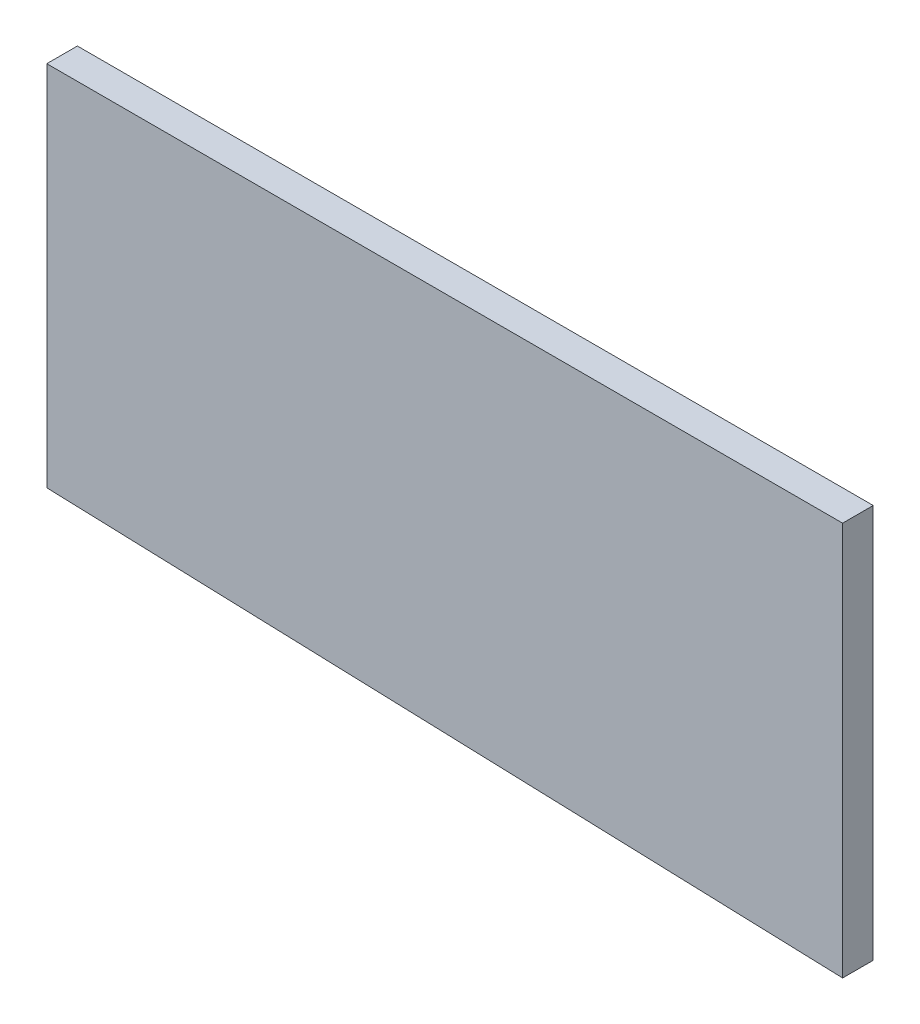
ISO-10303-21;
HEADER;
FILE_DESCRIPTION(('STEP AP214'),'2;1');
FILE_NAME('part.step','',(''),(''),'','','');
FILE_SCHEMA(('AUTOMOTIVE_DESIGN { 1 0 10303 214 1 1 1 1 }'));
ENDSEC;
DATA;
#1=APPLICATION_CONTEXT('core data for automotive mechanical design processes');
#2=APPLICATION_PROTOCOL_DEFINITION('international standard','automotive_design',2000,#1);
#3=PRODUCT_CONTEXT('',#1,'mechanical');
#4=PRODUCT('Part','Part','',(#3));
#5=PRODUCT_RELATED_PRODUCT_CATEGORY('part','',(#4));
#6=PRODUCT_DEFINITION_FORMATION('','',#4);
#7=PRODUCT_DEFINITION_CONTEXT('part definition',#1,'design');
#8=PRODUCT_DEFINITION('design','',#6,#7);
#9=PRODUCT_DEFINITION_SHAPE('','',#8);
#10=(LENGTH_UNIT() NAMED_UNIT(*) SI_UNIT(.MILLI.,.METRE.));
#11=(NAMED_UNIT(*) PLANE_ANGLE_UNIT() SI_UNIT($,.RADIAN.));
#12=(NAMED_UNIT(*) SI_UNIT($,.STERADIAN.) SOLID_ANGLE_UNIT());
#13=UNCERTAINTY_MEASURE_WITH_UNIT(LENGTH_MEASURE(1.E-05),#10,'distance_accuracy_value','');
#14=(GEOMETRIC_REPRESENTATION_CONTEXT(3) GLOBAL_UNCERTAINTY_ASSIGNED_CONTEXT((#13)) GLOBAL_UNIT_ASSIGNED_CONTEXT((#10,
#11,#12)) REPRESENTATION_CONTEXT('',''));
#15=CARTESIAN_POINT('',(0.,0.,0.));
#16=DIRECTION('',(0.,0.,1.));
#17=DIRECTION('',(1.,0.,0.));
#18=AXIS2_PLACEMENT_3D('',#15,#16,#17);
#19=CARTESIAN_POINT('',(0.,-60.,5.));
#20=DIRECTION('',(1.,0.,0.));
#21=DIRECTION('',(0.,0.,-1.));
#22=AXIS2_PLACEMENT_3D('',#19,#20,#21);
#23=PLANE('',#22);
#24=DIRECTION('',(0.,-1.,0.));
#25=VECTOR('',#24,1.);
#26=CARTESIAN_POINT('',(0.,-60.,0.));
#27=LINE('',#26,#25);
#28=CARTESIAN_POINT('',(0.,0.,0.));
#29=VERTEX_POINT('',#28);
#30=CARTESIAN_POINT('',(0.,-60.,0.));
#31=VERTEX_POINT('',#30);
#32=EDGE_CURVE('E107',#29,#31,#27,.T.);
#33=ORIENTED_EDGE('',*,*,#32,.T.);
#34=DIRECTION('',(0.,0.,-1.));
#35=VECTOR('',#34,1.);
#36=CARTESIAN_POINT('',(0.,-60.,5.));
#37=LINE('',#36,#35);
#38=CARTESIAN_POINT('',(0.,-60.,5.));
#39=VERTEX_POINT('',#38);
#40=EDGE_CURVE('E11',#39,#31,#37,.T.);
#41=ORIENTED_EDGE('',*,*,#40,.F.);
#42=DIRECTION('',(0.,-1.,0.));
#43=VECTOR('',#42,1.);
#44=CARTESIAN_POINT('',(0.,-60.,5.));
#45=LINE('',#44,#43);
#46=CARTESIAN_POINT('',(0.,0.,5.));
#47=VERTEX_POINT('',#46);
#48=EDGE_CURVE('E91',#47,#39,#45,.T.);
#49=ORIENTED_EDGE('',*,*,#48,.F.);
#50=DIRECTION('',(0.,0.,-1.));
#51=VECTOR('',#50,1.);
#52=CARTESIAN_POINT('',(0.,0.,5.));
#53=LINE('',#52,#51);
#54=EDGE_CURVE('E103',#47,#29,#53,.T.);
#55=ORIENTED_EDGE('',*,*,#54,.T.);
#56=EDGE_LOOP('',(#33,#41,#49,#55));
#57=FACE_BOUND('',#56,.T.);
#58=ADVANCED_FACE('F39',(#57),#23,.F.);
#59=CARTESIAN_POINT('',(130.,-64.3463687150838,5.));
#60=DIRECTION('',(0.0334149350096506,0.999441565134401,0.));
#61=DIRECTION('',(-0.999441565134401,0.0334149350096506,0.));
#62=AXIS2_PLACEMENT_3D('',#59,#60,#61);
#63=PLANE('',#62);
#64=DIRECTION('',(0.999441565134401,-0.0334149350096506,0.));
#65=VECTOR('',#64,1.);
#66=CARTESIAN_POINT('',(130.,-64.3463687150838,0.));
#67=LINE('',#66,#65);
#68=CARTESIAN_POINT('',(130.,-64.3463687150838,0.));
#69=VERTEX_POINT('',#68);
#70=EDGE_CURVE('E96',#31,#69,#67,.T.);
#71=ORIENTED_EDGE('',*,*,#70,.T.);
#72=DIRECTION('',(0.,0.,-1.));
#73=VECTOR('',#72,1.);
#74=CARTESIAN_POINT('',(130.,-64.3463687150838,5.));
#75=LINE('',#74,#73);
#76=CARTESIAN_POINT('',(130.,-64.3463687150838,5.));
#77=VERTEX_POINT('',#76);
#78=EDGE_CURVE('E48',#77,#69,#75,.T.);
#79=ORIENTED_EDGE('',*,*,#78,.F.);
#80=DIRECTION('',(0.999441565134401,-0.0334149350096506,0.));
#81=VECTOR('',#80,1.);
#82=CARTESIAN_POINT('',(130.,-64.3463687150838,5.));
#83=LINE('',#82,#81);
#84=EDGE_CURVE('E86',#39,#77,#83,.T.);
#85=ORIENTED_EDGE('',*,*,#84,.F.);
#86=ORIENTED_EDGE('',*,*,#40,.T.);
#87=EDGE_LOOP('',(#71,#79,#85,#86));
#88=FACE_BOUND('',#87,.T.);
#89=ADVANCED_FACE('F95',(#88),#63,.F.);
#90=CARTESIAN_POINT('',(130.,0.,5.));
#91=DIRECTION('',(-1.,0.,0.));
#92=DIRECTION('',(0.,0.,1.));
#93=AXIS2_PLACEMENT_3D('',#90,#91,#92);
#94=PLANE('',#93);
#95=DIRECTION('',(0.,1.,0.));
#96=VECTOR('',#95,1.);
#97=CARTESIAN_POINT('',(130.,0.,0.));
#98=LINE('',#97,#96);
#99=CARTESIAN_POINT('',(130.,0.,0.));
#100=VERTEX_POINT('',#99);
#101=EDGE_CURVE('E73',#69,#100,#98,.T.);
#102=ORIENTED_EDGE('',*,*,#101,.T.);
#103=DIRECTION('',(0.,0.,-1.));
#104=VECTOR('',#103,1.);
#105=CARTESIAN_POINT('',(130.,0.,5.));
#106=LINE('',#105,#104);
#107=CARTESIAN_POINT('',(130.,0.,5.));
#108=VERTEX_POINT('',#107);
#109=EDGE_CURVE('E98',#108,#100,#106,.T.);
#110=ORIENTED_EDGE('',*,*,#109,.F.);
#111=DIRECTION('',(0.,1.,0.));
#112=VECTOR('',#111,1.);
#113=CARTESIAN_POINT('',(130.,0.,5.));
#114=LINE('',#113,#112);
#115=EDGE_CURVE('E89',#77,#108,#114,.T.);
#116=ORIENTED_EDGE('',*,*,#115,.F.);
#117=ORIENTED_EDGE('',*,*,#78,.T.);
#118=EDGE_LOOP('',(#102,#110,#116,#117));
#119=FACE_BOUND('',#118,.T.);
#120=ADVANCED_FACE('F99',(#119),#94,.F.);
#121=CARTESIAN_POINT('',(0.,0.,5.));
#122=DIRECTION('',(0.,-1.,0.));
#123=DIRECTION('',(0.,0.,-1.));
#124=AXIS2_PLACEMENT_3D('',#121,#122,#123);
#125=PLANE('',#124);
#126=DIRECTION('',(-1.,0.,0.));
#127=VECTOR('',#126,1.);
#128=CARTESIAN_POINT('',(0.,0.,0.));
#129=LINE('',#128,#127);
#130=EDGE_CURVE('E79',#100,#29,#129,.T.);
#131=ORIENTED_EDGE('',*,*,#130,.T.);
#132=ORIENTED_EDGE('',*,*,#54,.F.);
#133=DIRECTION('',(-1.,0.,0.));
#134=VECTOR('',#133,1.);
#135=CARTESIAN_POINT('',(0.,0.,5.));
#136=LINE('',#135,#134);
#137=EDGE_CURVE('E56',#108,#47,#136,.T.);
#138=ORIENTED_EDGE('',*,*,#137,.F.);
#139=ORIENTED_EDGE('',*,*,#109,.T.);
#140=EDGE_LOOP('',(#131,#132,#138,#139));
#141=FACE_BOUND('',#140,.T.);
#142=ADVANCED_FACE('F120',(#141),#125,.F.);
#143=CARTESIAN_POINT('',(0.,0.,5.));
#144=DIRECTION('',(0.,0.,-1.));
#145=DIRECTION('',(-1.,0.,0.));
#146=AXIS2_PLACEMENT_3D('',#143,#144,#145);
#147=PLANE('',#146);
#148=ORIENTED_EDGE('',*,*,#48,.T.);
#149=ORIENTED_EDGE('',*,*,#84,.T.);
#150=ORIENTED_EDGE('',*,*,#115,.T.);
#151=ORIENTED_EDGE('',*,*,#137,.T.);
#152=EDGE_LOOP('',(#148,#149,#150,#151));
#153=FACE_BOUND('',#152,.T.);
#154=ADVANCED_FACE('F87',(#153),#147,.F.);
#155=CARTESIAN_POINT('',(0.,0.,0.));
#156=DIRECTION('',(0.,0.,-1.));
#157=DIRECTION('',(-1.,0.,0.));
#158=AXIS2_PLACEMENT_3D('',#155,#156,#157);
#159=PLANE('',#158);
#160=ORIENTED_EDGE('',*,*,#32,.F.);
#161=ORIENTED_EDGE('',*,*,#130,.F.);
#162=ORIENTED_EDGE('',*,*,#101,.F.);
#163=ORIENTED_EDGE('',*,*,#70,.F.);
#164=EDGE_LOOP('',(#160,#161,#162,#163));
#165=FACE_BOUND('',#164,.T.);
#166=ADVANCED_FACE('F123',(#165),#159,.T.);
#167=CLOSED_SHELL('',(#58,#89,#120,#142,#154,#166));
#168=MANIFOLD_SOLID_BREP('B2',#167);
#169=ADVANCED_BREP_SHAPE_REPRESENTATION('',(#18,#168),#14);
#170=SHAPE_DEFINITION_REPRESENTATION(#9,#169);
ENDSEC;
END-ISO-10303-21;
